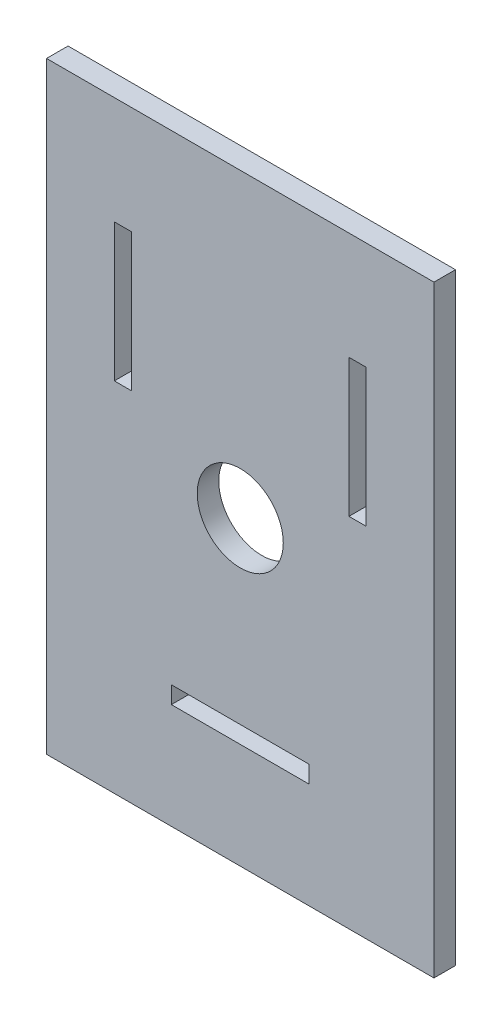
ISO-10303-21;
HEADER;
FILE_DESCRIPTION(('STEP AP214'),'2;1');
FILE_NAME('part.step','',(''),(''),'','','');
FILE_SCHEMA(('AUTOMOTIVE_DESIGN { 1 0 10303 214 1 1 1 1 }'));
ENDSEC;
DATA;
#1=APPLICATION_CONTEXT('core data for automotive mechanical design processes');
#2=APPLICATION_PROTOCOL_DEFINITION('international standard','automotive_design',2000,#1);
#3=PRODUCT_CONTEXT('',#1,'mechanical');
#4=PRODUCT('Part','Part','',(#3));
#5=PRODUCT_RELATED_PRODUCT_CATEGORY('part','',(#4));
#6=PRODUCT_DEFINITION_FORMATION('','',#4);
#7=PRODUCT_DEFINITION_CONTEXT('part definition',#1,'design');
#8=PRODUCT_DEFINITION('design','',#6,#7);
#9=PRODUCT_DEFINITION_SHAPE('','',#8);
#10=(LENGTH_UNIT() NAMED_UNIT(*) SI_UNIT(.MILLI.,.METRE.));
#11=(NAMED_UNIT(*) PLANE_ANGLE_UNIT() SI_UNIT($,.RADIAN.));
#12=(NAMED_UNIT(*) SI_UNIT($,.STERADIAN.) SOLID_ANGLE_UNIT());
#13=UNCERTAINTY_MEASURE_WITH_UNIT(LENGTH_MEASURE(1.E-05),#10,'distance_accuracy_value','');
#14=(GEOMETRIC_REPRESENTATION_CONTEXT(3) GLOBAL_UNCERTAINTY_ASSIGNED_CONTEXT((#13)) GLOBAL_UNIT_ASSIGNED_CONTEXT((#10,
#11,#12)) REPRESENTATION_CONTEXT('',''));
#15=CARTESIAN_POINT('',(0.,0.,0.));
#16=DIRECTION('',(0.,0.,1.));
#17=DIRECTION('',(1.,0.,0.));
#18=AXIS2_PLACEMENT_3D('',#15,#16,#17);
#19=CARTESIAN_POINT('',(0.,0.,-1.));
#20=DIRECTION('',(0.,0.,1.));
#21=DIRECTION('',(1.,0.,0.));
#22=AXIS2_PLACEMENT_3D('',#19,#20,#21);
#23=PLANE('',#22);
#24=DIRECTION('',(1.,0.,0.));
#25=VECTOR('',#24,1.);
#26=CARTESIAN_POINT('',(0.,-9.09999999999999,-1.));
#27=LINE('',#26,#25);
#28=CARTESIAN_POINT('',(-3.2,-9.09999999999999,-1.));
#29=VERTEX_POINT('',#28);
#30=CARTESIAN_POINT('',(3.2,-9.09999999999999,-1.));
#31=VERTEX_POINT('',#30);
#32=EDGE_CURVE('E177',#29,#31,#27,.T.);
#33=ORIENTED_EDGE('',*,*,#32,.T.);
#34=DIRECTION('',(0.,1.,0.));
#35=VECTOR('',#34,1.);
#36=CARTESIAN_POINT('',(3.2,0.,-1.));
#37=LINE('',#36,#35);
#38=CARTESIAN_POINT('',(3.2,-8.29999999999999,-1.));
#39=VERTEX_POINT('',#38);
#40=EDGE_CURVE('E180',#31,#39,#37,.T.);
#41=ORIENTED_EDGE('',*,*,#40,.T.);
#42=DIRECTION('',(-1.,0.,0.));
#43=VECTOR('',#42,1.);
#44=CARTESIAN_POINT('',(0.,-8.29999999999999,-1.));
#45=LINE('',#44,#43);
#46=CARTESIAN_POINT('',(-3.2,-8.29999999999999,-1.));
#47=VERTEX_POINT('',#46);
#48=EDGE_CURVE('E172',#39,#47,#45,.T.);
#49=ORIENTED_EDGE('',*,*,#48,.T.);
#50=DIRECTION('',(0.,-1.,0.));
#51=VECTOR('',#50,1.);
#52=CARTESIAN_POINT('',(-3.2,0.,-1.));
#53=LINE('',#52,#51);
#54=EDGE_CURVE('E152',#47,#29,#53,.T.);
#55=ORIENTED_EDGE('',*,*,#54,.T.);
#56=EDGE_LOOP('',(#33,#41,#49,#55));
#57=FACE_BOUND('',#56,.T.);
#58=CARTESIAN_POINT('',(0.,0.,-1.));
#59=DIRECTION('',(0.,0.,1.));
#60=DIRECTION('',(1.,0.,0.));
#61=AXIS2_PLACEMENT_3D('',#58,#59,#60);
#62=CIRCLE('',#61,2.);
#63=CARTESIAN_POINT('',(2.,0.,-1.));
#64=VERTEX_POINT('',#63);
#65=EDGE_CURVE('E184',#64,#64,#62,.T.);
#66=ORIENTED_EDGE('',*,*,#65,.T.);
#67=EDGE_LOOP('',(#66));
#68=FACE_BOUND('',#67,.T.);
#69=DIRECTION('',(0.,1.,0.));
#70=VECTOR('',#69,1.);
#71=CARTESIAN_POINT('',(8.99999999999999,14.,-1.));
#72=LINE('',#71,#70);
#73=CARTESIAN_POINT('',(9.,-14.,-1.));
#74=VERTEX_POINT('',#73);
#75=CARTESIAN_POINT('',(8.99999999999999,14.,-1.));
#76=VERTEX_POINT('',#75);
#77=EDGE_CURVE('E252',#74,#76,#72,.T.);
#78=ORIENTED_EDGE('',*,*,#77,.F.);
#79=DIRECTION('',(1.,0.,0.));
#80=VECTOR('',#79,1.);
#81=CARTESIAN_POINT('',(-9.,-14.,-1.));
#82=LINE('',#81,#80);
#83=CARTESIAN_POINT('',(-9.,-14.,-1.));
#84=VERTEX_POINT('',#83);
#85=EDGE_CURVE('E262',#84,#74,#82,.T.);
#86=ORIENTED_EDGE('',*,*,#85,.F.);
#87=DIRECTION('',(0.,-1.,0.));
#88=VECTOR('',#87,1.);
#89=CARTESIAN_POINT('',(-9.00000000000001,14.,-1.));
#90=LINE('',#89,#88);
#91=CARTESIAN_POINT('',(-9.00000000000001,14.,-1.));
#92=VERTEX_POINT('',#91);
#93=EDGE_CURVE('E259',#92,#84,#90,.T.);
#94=ORIENTED_EDGE('',*,*,#93,.F.);
#95=DIRECTION('',(-1.,0.,0.));
#96=VECTOR('',#95,1.);
#97=CARTESIAN_POINT('',(-9.00000000000001,14.,-1.));
#98=LINE('',#97,#96);
#99=EDGE_CURVE('E255',#76,#92,#98,.T.);
#100=ORIENTED_EDGE('',*,*,#99,.F.);
#101=EDGE_LOOP('',(#78,#86,#94,#100));
#102=FACE_BOUND('',#101,.T.);
#103=DIRECTION('',(1.,0.,0.));
#104=VECTOR('',#103,1.);
#105=CARTESIAN_POINT('',(0.,2.60000000000001,-1.));
#106=LINE('',#105,#104);
#107=CARTESIAN_POINT('',(5.05,2.60000000000001,-1.));
#108=VERTEX_POINT('',#107);
#109=CARTESIAN_POINT('',(5.85,2.60000000000001,-1.));
#110=VERTEX_POINT('',#109);
#111=EDGE_CURVE('E245',#108,#110,#106,.T.);
#112=ORIENTED_EDGE('',*,*,#111,.T.);
#113=DIRECTION('',(0.,1.,0.));
#114=VECTOR('',#113,1.);
#115=CARTESIAN_POINT('',(5.85,0.,-1.));
#116=LINE('',#115,#114);
#117=CARTESIAN_POINT('',(5.85,9.00000000000001,-1.));
#118=VERTEX_POINT('',#117);
#119=EDGE_CURVE('E248',#110,#118,#116,.T.);
#120=ORIENTED_EDGE('',*,*,#119,.T.);
#121=DIRECTION('',(-1.,0.,0.));
#122=VECTOR('',#121,1.);
#123=CARTESIAN_POINT('',(0.,9.00000000000001,-1.));
#124=LINE('',#123,#122);
#125=CARTESIAN_POINT('',(5.05,9.00000000000001,-1.));
#126=VERTEX_POINT('',#125);
#127=EDGE_CURVE('E233',#118,#126,#124,.T.);
#128=ORIENTED_EDGE('',*,*,#127,.T.);
#129=DIRECTION('',(0.,-1.,0.));
#130=VECTOR('',#129,1.);
#131=CARTESIAN_POINT('',(5.05,0.,-1.));
#132=LINE('',#131,#130);
#133=EDGE_CURVE('E242',#126,#108,#132,.T.);
#134=ORIENTED_EDGE('',*,*,#133,.T.);
#135=EDGE_LOOP('',(#112,#120,#128,#134));
#136=FACE_BOUND('',#135,.T.);
#137=DIRECTION('',(0.,1.,0.));
#138=VECTOR('',#137,1.);
#139=CARTESIAN_POINT('',(-5.85,0.,-1.));
#140=LINE('',#139,#138);
#141=CARTESIAN_POINT('',(-5.85,2.60000000000001,-1.));
#142=VERTEX_POINT('',#141);
#143=CARTESIAN_POINT('',(-5.85,9.00000000000001,-1.));
#144=VERTEX_POINT('',#143);
#145=EDGE_CURVE('E217',#142,#144,#140,.T.);
#146=ORIENTED_EDGE('',*,*,#145,.F.);
#147=DIRECTION('',(-1.,0.,0.));
#148=VECTOR('',#147,1.);
#149=CARTESIAN_POINT('',(0.,2.60000000000001,-1.));
#150=LINE('',#149,#148);
#151=CARTESIAN_POINT('',(-5.05,2.60000000000001,-1.));
#152=VERTEX_POINT('',#151);
#153=EDGE_CURVE('E204',#152,#142,#150,.T.);
#154=ORIENTED_EDGE('',*,*,#153,.F.);
#155=DIRECTION('',(0.,-1.,0.));
#156=VECTOR('',#155,1.);
#157=CARTESIAN_POINT('',(-5.05,0.,-1.));
#158=LINE('',#157,#156);
#159=CARTESIAN_POINT('',(-5.05,9.00000000000001,-1.));
#160=VERTEX_POINT('',#159);
#161=EDGE_CURVE('E212',#160,#152,#158,.T.);
#162=ORIENTED_EDGE('',*,*,#161,.F.);
#163=DIRECTION('',(1.,0.,0.));
#164=VECTOR('',#163,1.);
#165=CARTESIAN_POINT('',(0.,9.00000000000001,-1.));
#166=LINE('',#165,#164);
#167=EDGE_CURVE('E215',#144,#160,#166,.T.);
#168=ORIENTED_EDGE('',*,*,#167,.F.);
#169=EDGE_LOOP('',(#146,#154,#162,#168));
#170=FACE_BOUND('',#169,.T.);
#171=ADVANCED_FACE('F32',(#57,#68,#102,#136,#170),#23,.F.);
#172=CARTESIAN_POINT('',(0.,0.,0.));
#173=DIRECTION('',(0.,0.,1.));
#174=DIRECTION('',(1.,0.,0.));
#175=AXIS2_PLACEMENT_3D('',#172,#173,#174);
#176=PLANE('',#175);
#177=DIRECTION('',(0.,1.,0.));
#178=VECTOR('',#177,1.);
#179=CARTESIAN_POINT('',(3.2,-8.29999999999999,0.));
#180=LINE('',#179,#178);
#181=CARTESIAN_POINT('',(3.2,-9.09999999999999,0.));
#182=VERTEX_POINT('',#181);
#183=CARTESIAN_POINT('',(3.2,-8.29999999999999,0.));
#184=VERTEX_POINT('',#183);
#185=EDGE_CURVE('E57',#182,#184,#180,.T.);
#186=ORIENTED_EDGE('',*,*,#185,.F.);
#187=DIRECTION('',(1.,0.,0.));
#188=VECTOR('',#187,1.);
#189=CARTESIAN_POINT('',(-3.2,-9.09999999999999,0.));
#190=LINE('',#189,#188);
#191=CARTESIAN_POINT('',(-3.2,-9.09999999999999,0.));
#192=VERTEX_POINT('',#191);
#193=EDGE_CURVE('E165',#192,#182,#190,.T.);
#194=ORIENTED_EDGE('',*,*,#193,.F.);
#195=DIRECTION('',(0.,-1.,0.));
#196=VECTOR('',#195,1.);
#197=CARTESIAN_POINT('',(-3.2,-8.29999999999999,0.));
#198=LINE('',#197,#196);
#199=CARTESIAN_POINT('',(-3.2,-8.29999999999999,0.));
#200=VERTEX_POINT('',#199);
#201=EDGE_CURVE('E149',#200,#192,#198,.T.);
#202=ORIENTED_EDGE('',*,*,#201,.F.);
#203=DIRECTION('',(-1.,0.,0.));
#204=VECTOR('',#203,1.);
#205=CARTESIAN_POINT('',(-3.2,-8.29999999999999,0.));
#206=LINE('',#205,#204);
#207=EDGE_CURVE('E158',#184,#200,#206,.T.);
#208=ORIENTED_EDGE('',*,*,#207,.F.);
#209=EDGE_LOOP('',(#186,#194,#202,#208));
#210=FACE_BOUND('',#209,.T.);
#211=CARTESIAN_POINT('',(0.,0.,0.));
#212=DIRECTION('',(0.,0.,1.));
#213=DIRECTION('',(1.,0.,0.));
#214=AXIS2_PLACEMENT_3D('',#211,#212,#213);
#215=CIRCLE('',#214,2.);
#216=CARTESIAN_POINT('',(2.,0.,0.));
#217=VERTEX_POINT('',#216);
#218=EDGE_CURVE('E183',#217,#217,#215,.T.);
#219=ORIENTED_EDGE('',*,*,#218,.F.);
#220=EDGE_LOOP('',(#219));
#221=FACE_BOUND('',#220,.T.);
#222=DIRECTION('',(0.,1.,0.));
#223=VECTOR('',#222,1.);
#224=CARTESIAN_POINT('',(5.85,9.00000000000001,0.));
#225=LINE('',#224,#223);
#226=CARTESIAN_POINT('',(5.85,2.60000000000001,0.));
#227=VERTEX_POINT('',#226);
#228=CARTESIAN_POINT('',(5.85,9.00000000000001,0.));
#229=VERTEX_POINT('',#228);
#230=EDGE_CURVE('E219',#227,#229,#225,.T.);
#231=ORIENTED_EDGE('',*,*,#230,.F.);
#232=DIRECTION('',(1.,0.,0.));
#233=VECTOR('',#232,1.);
#234=CARTESIAN_POINT('',(5.05,2.60000000000001,0.));
#235=LINE('',#234,#233);
#236=CARTESIAN_POINT('',(5.05,2.60000000000001,0.));
#237=VERTEX_POINT('',#236);
#238=EDGE_CURVE('E227',#237,#227,#235,.T.);
#239=ORIENTED_EDGE('',*,*,#238,.F.);
#240=DIRECTION('',(0.,-1.,0.));
#241=VECTOR('',#240,1.);
#242=CARTESIAN_POINT('',(5.05,9.00000000000001,0.));
#243=LINE('',#242,#241);
#244=CARTESIAN_POINT('',(5.05,9.00000000000001,0.));
#245=VERTEX_POINT('',#244);
#246=EDGE_CURVE('E224',#245,#237,#243,.T.);
#247=ORIENTED_EDGE('',*,*,#246,.F.);
#248=DIRECTION('',(-1.,0.,0.));
#249=VECTOR('',#248,1.);
#250=CARTESIAN_POINT('',(5.05,9.00000000000001,0.));
#251=LINE('',#250,#249);
#252=EDGE_CURVE('E221',#229,#245,#251,.T.);
#253=ORIENTED_EDGE('',*,*,#252,.F.);
#254=EDGE_LOOP('',(#231,#239,#247,#253));
#255=FACE_BOUND('',#254,.T.);
#256=DIRECTION('',(0.,1.,0.));
#257=VECTOR('',#256,1.);
#258=CARTESIAN_POINT('',(8.99999999999999,14.,0.));
#259=LINE('',#258,#257);
#260=CARTESIAN_POINT('',(9.,-14.,0.));
#261=VERTEX_POINT('',#260);
#262=CARTESIAN_POINT('',(8.99999999999999,14.,0.));
#263=VERTEX_POINT('',#262);
#264=EDGE_CURVE('E251',#261,#263,#259,.T.);
#265=ORIENTED_EDGE('',*,*,#264,.T.);
#266=DIRECTION('',(-1.,0.,0.));
#267=VECTOR('',#266,1.);
#268=CARTESIAN_POINT('',(-9.00000000000001,14.,0.));
#269=LINE('',#268,#267);
#270=CARTESIAN_POINT('',(-9.00000000000001,14.,0.));
#271=VERTEX_POINT('',#270);
#272=EDGE_CURVE('E267',#263,#271,#269,.T.);
#273=ORIENTED_EDGE('',*,*,#272,.T.);
#274=DIRECTION('',(0.,-1.,0.));
#275=VECTOR('',#274,1.);
#276=CARTESIAN_POINT('',(-9.00000000000001,14.,0.));
#277=LINE('',#276,#275);
#278=CARTESIAN_POINT('',(-9.,-14.,0.));
#279=VERTEX_POINT('',#278);
#280=EDGE_CURVE('E270',#271,#279,#277,.T.);
#281=ORIENTED_EDGE('',*,*,#280,.T.);
#282=DIRECTION('',(1.,0.,0.));
#283=VECTOR('',#282,1.);
#284=CARTESIAN_POINT('',(-9.,-14.,0.));
#285=LINE('',#284,#283);
#286=EDGE_CURVE('E256',#279,#261,#285,.T.);
#287=ORIENTED_EDGE('',*,*,#286,.T.);
#288=EDGE_LOOP('',(#265,#273,#281,#287));
#289=FACE_BOUND('',#288,.T.);
#290=DIRECTION('',(-1.,0.,0.));
#291=VECTOR('',#290,1.);
#292=CARTESIAN_POINT('',(-5.05,2.60000000000001,0.));
#293=LINE('',#292,#291);
#294=CARTESIAN_POINT('',(-5.05,2.60000000000001,0.));
#295=VERTEX_POINT('',#294);
#296=CARTESIAN_POINT('',(-5.85,2.60000000000001,0.));
#297=VERTEX_POINT('',#296);
#298=EDGE_CURVE('E192',#295,#297,#293,.T.);
#299=ORIENTED_EDGE('',*,*,#298,.T.);
#300=DIRECTION('',(0.,1.,0.));
#301=VECTOR('',#300,1.);
#302=CARTESIAN_POINT('',(-5.85,9.00000000000001,0.));
#303=LINE('',#302,#301);
#304=CARTESIAN_POINT('',(-5.85,9.00000000000001,0.));
#305=VERTEX_POINT('',#304);
#306=EDGE_CURVE('E187',#297,#305,#303,.T.);
#307=ORIENTED_EDGE('',*,*,#306,.T.);
#308=DIRECTION('',(1.,0.,0.));
#309=VECTOR('',#308,1.);
#310=CARTESIAN_POINT('',(-5.05,9.00000000000001,0.));
#311=LINE('',#310,#309);
#312=CARTESIAN_POINT('',(-5.05,9.00000000000001,0.));
#313=VERTEX_POINT('',#312);
#314=EDGE_CURVE('E198',#305,#313,#311,.T.);
#315=ORIENTED_EDGE('',*,*,#314,.T.);
#316=DIRECTION('',(0.,-1.,0.));
#317=VECTOR('',#316,1.);
#318=CARTESIAN_POINT('',(-5.05,9.00000000000001,0.));
#319=LINE('',#318,#317);
#320=EDGE_CURVE('E195',#313,#295,#319,.T.);
#321=ORIENTED_EDGE('',*,*,#320,.T.);
#322=EDGE_LOOP('',(#299,#307,#315,#321));
#323=FACE_BOUND('',#322,.T.);
#324=ADVANCED_FACE('F162',(#210,#221,#255,#289,#323),#176,.T.);
#325=CARTESIAN_POINT('',(8.99999999999999,14.,-1.));
#326=DIRECTION('',(1.,0.,0.));
#327=DIRECTION('',(0.,1.,0.));
#328=AXIS2_PLACEMENT_3D('',#325,#326,#327);
#329=PLANE('',#328);
#330=ORIENTED_EDGE('',*,*,#264,.F.);
#331=DIRECTION('',(0.,0.,1.));
#332=VECTOR('',#331,1.);
#333=CARTESIAN_POINT('',(9.,-14.,-1.));
#334=LINE('',#333,#332);
#335=EDGE_CURVE('E11',#74,#261,#334,.T.);
#336=ORIENTED_EDGE('',*,*,#335,.F.);
#337=ORIENTED_EDGE('',*,*,#77,.T.);
#338=DIRECTION('',(0.,0.,1.));
#339=VECTOR('',#338,1.);
#340=CARTESIAN_POINT('',(8.99999999999999,14.,-1.));
#341=LINE('',#340,#339);
#342=EDGE_CURVE('E36',#76,#263,#341,.T.);
#343=ORIENTED_EDGE('',*,*,#342,.T.);
#344=EDGE_LOOP('',(#330,#336,#337,#343));
#345=FACE_BOUND('',#344,.T.);
#346=ADVANCED_FACE('F34',(#345),#329,.T.);
#347=CARTESIAN_POINT('',(-9.,-14.,-1.));
#348=DIRECTION('',(0.,-1.,0.));
#349=DIRECTION('',(0.,0.,-1.));
#350=AXIS2_PLACEMENT_3D('',#347,#348,#349);
#351=PLANE('',#350);
#352=ORIENTED_EDGE('',*,*,#286,.F.);
#353=DIRECTION('',(0.,0.,1.));
#354=VECTOR('',#353,1.);
#355=CARTESIAN_POINT('',(-9.,-14.,-1.));
#356=LINE('',#355,#354);
#357=EDGE_CURVE('E41',#84,#279,#356,.T.);
#358=ORIENTED_EDGE('',*,*,#357,.F.);
#359=ORIENTED_EDGE('',*,*,#85,.T.);
#360=ORIENTED_EDGE('',*,*,#335,.T.);
#361=EDGE_LOOP('',(#352,#358,#359,#360));
#362=FACE_BOUND('',#361,.T.);
#363=ADVANCED_FACE('F288',(#362),#351,.T.);
#364=CARTESIAN_POINT('',(-9.00000000000001,14.,-1.));
#365=DIRECTION('',(-1.,0.,0.));
#366=DIRECTION('',(0.,-1.,0.));
#367=AXIS2_PLACEMENT_3D('',#364,#365,#366);
#368=PLANE('',#367);
#369=ORIENTED_EDGE('',*,*,#280,.F.);
#370=DIRECTION('',(0.,0.,1.));
#371=VECTOR('',#370,1.);
#372=CARTESIAN_POINT('',(-9.00000000000001,14.,-1.));
#373=LINE('',#372,#371);
#374=EDGE_CURVE('E275',#92,#271,#373,.T.);
#375=ORIENTED_EDGE('',*,*,#374,.F.);
#376=ORIENTED_EDGE('',*,*,#93,.T.);
#377=ORIENTED_EDGE('',*,*,#357,.T.);
#378=EDGE_LOOP('',(#369,#375,#376,#377));
#379=FACE_BOUND('',#378,.T.);
#380=ADVANCED_FACE('F294',(#379),#368,.T.);
#381=CARTESIAN_POINT('',(-9.00000000000001,14.,-1.));
#382=DIRECTION('',(0.,1.,0.));
#383=DIRECTION('',(0.,0.,1.));
#384=AXIS2_PLACEMENT_3D('',#381,#382,#383);
#385=PLANE('',#384);
#386=ORIENTED_EDGE('',*,*,#272,.F.);
#387=ORIENTED_EDGE('',*,*,#342,.F.);
#388=ORIENTED_EDGE('',*,*,#99,.T.);
#389=ORIENTED_EDGE('',*,*,#374,.T.);
#390=EDGE_LOOP('',(#386,#387,#388,#389));
#391=FACE_BOUND('',#390,.T.);
#392=ADVANCED_FACE('F283',(#391),#385,.T.);
#393=CARTESIAN_POINT('',(5.85,9.00000000000001,-1.6));
#394=DIRECTION('',(1.,0.,0.));
#395=DIRECTION('',(0.,1.,0.));
#396=AXIS2_PLACEMENT_3D('',#393,#394,#395);
#397=PLANE('',#396);
#398=DIRECTION('',(0.,0.,1.));
#399=VECTOR('',#398,1.);
#400=CARTESIAN_POINT('',(5.85,2.60000000000001,-1.6));
#401=LINE('',#400,#399);
#402=EDGE_CURVE('E231',#110,#227,#401,.T.);
#403=ORIENTED_EDGE('',*,*,#402,.T.);
#404=ORIENTED_EDGE('',*,*,#230,.T.);
#405=DIRECTION('',(0.,0.,1.));
#406=VECTOR('',#405,1.);
#407=CARTESIAN_POINT('',(5.85,9.00000000000001,-1.6));
#408=LINE('',#407,#406);
#409=EDGE_CURVE('E230',#118,#229,#408,.T.);
#410=ORIENTED_EDGE('',*,*,#409,.F.);
#411=ORIENTED_EDGE('',*,*,#119,.F.);
#412=EDGE_LOOP('',(#403,#404,#410,#411));
#413=FACE_BOUND('',#412,.T.);
#414=ADVANCED_FACE('F301',(#413),#397,.F.);
#415=CARTESIAN_POINT('',(5.05,2.60000000000001,-1.6));
#416=DIRECTION('',(0.,-1.,0.));
#417=DIRECTION('',(0.,0.,-1.));
#418=AXIS2_PLACEMENT_3D('',#415,#416,#417);
#419=PLANE('',#418);
#420=DIRECTION('',(0.,0.,1.));
#421=VECTOR('',#420,1.);
#422=CARTESIAN_POINT('',(5.05,2.60000000000001,-1.6));
#423=LINE('',#422,#421);
#424=EDGE_CURVE('E234',#108,#237,#423,.T.);
#425=ORIENTED_EDGE('',*,*,#424,.T.);
#426=ORIENTED_EDGE('',*,*,#238,.T.);
#427=ORIENTED_EDGE('',*,*,#402,.F.);
#428=ORIENTED_EDGE('',*,*,#111,.F.);
#429=EDGE_LOOP('',(#425,#426,#427,#428));
#430=FACE_BOUND('',#429,.T.);
#431=ADVANCED_FACE('F314',(#430),#419,.F.);
#432=CARTESIAN_POINT('',(5.05,9.00000000000001,-1.6));
#433=DIRECTION('',(-1.,0.,0.));
#434=DIRECTION('',(0.,-1.,0.));
#435=AXIS2_PLACEMENT_3D('',#432,#433,#434);
#436=PLANE('',#435);
#437=DIRECTION('',(0.,0.,1.));
#438=VECTOR('',#437,1.);
#439=CARTESIAN_POINT('',(5.05,9.00000000000001,-1.6));
#440=LINE('',#439,#438);
#441=EDGE_CURVE('E236',#126,#245,#440,.T.);
#442=ORIENTED_EDGE('',*,*,#441,.T.);
#443=ORIENTED_EDGE('',*,*,#246,.T.);
#444=ORIENTED_EDGE('',*,*,#424,.F.);
#445=ORIENTED_EDGE('',*,*,#133,.F.);
#446=EDGE_LOOP('',(#442,#443,#444,#445));
#447=FACE_BOUND('',#446,.T.);
#448=ADVANCED_FACE('F320',(#447),#436,.F.);
#449=CARTESIAN_POINT('',(5.05,9.00000000000001,-1.6));
#450=DIRECTION('',(0.,1.,0.));
#451=DIRECTION('',(0.,0.,1.));
#452=AXIS2_PLACEMENT_3D('',#449,#450,#451);
#453=PLANE('',#452);
#454=ORIENTED_EDGE('',*,*,#409,.T.);
#455=ORIENTED_EDGE('',*,*,#252,.T.);
#456=ORIENTED_EDGE('',*,*,#441,.F.);
#457=ORIENTED_EDGE('',*,*,#127,.F.);
#458=EDGE_LOOP('',(#454,#455,#456,#457));
#459=FACE_BOUND('',#458,.T.);
#460=ADVANCED_FACE('F316',(#459),#453,.F.);
#461=CARTESIAN_POINT('',(-5.85,9.00000000000001,-1.6));
#462=DIRECTION('',(1.,0.,0.));
#463=DIRECTION('',(0.,1.,0.));
#464=AXIS2_PLACEMENT_3D('',#461,#462,#463);
#465=PLANE('',#464);
#466=ORIENTED_EDGE('',*,*,#145,.T.);
#467=DIRECTION('',(0.,0.,1.));
#468=VECTOR('',#467,1.);
#469=CARTESIAN_POINT('',(-5.85,9.00000000000001,-1.6));
#470=LINE('',#469,#468);
#471=EDGE_CURVE('E202',#144,#305,#470,.T.);
#472=ORIENTED_EDGE('',*,*,#471,.T.);
#473=ORIENTED_EDGE('',*,*,#306,.F.);
#474=DIRECTION('',(0.,0.,1.));
#475=VECTOR('',#474,1.);
#476=CARTESIAN_POINT('',(-5.85,2.60000000000001,-1.6));
#477=LINE('',#476,#475);
#478=EDGE_CURVE('E201',#142,#297,#477,.T.);
#479=ORIENTED_EDGE('',*,*,#478,.F.);
#480=EDGE_LOOP('',(#466,#472,#473,#479));
#481=FACE_BOUND('',#480,.T.);
#482=ADVANCED_FACE('F319',(#481),#465,.T.);
#483=CARTESIAN_POINT('',(-5.05,9.00000000000001,-1.6));
#484=DIRECTION('',(0.,-1.,0.));
#485=DIRECTION('',(0.,0.,-1.));
#486=AXIS2_PLACEMENT_3D('',#483,#484,#485);
#487=PLANE('',#486);
#488=ORIENTED_EDGE('',*,*,#167,.T.);
#489=DIRECTION('',(0.,0.,1.));
#490=VECTOR('',#489,1.);
#491=CARTESIAN_POINT('',(-5.05,9.00000000000001,-1.6));
#492=LINE('',#491,#490);
#493=EDGE_CURVE('E205',#160,#313,#492,.T.);
#494=ORIENTED_EDGE('',*,*,#493,.T.);
#495=ORIENTED_EDGE('',*,*,#314,.F.);
#496=ORIENTED_EDGE('',*,*,#471,.F.);
#497=EDGE_LOOP('',(#488,#494,#495,#496));
#498=FACE_BOUND('',#497,.T.);
#499=ADVANCED_FACE('F330',(#498),#487,.T.);
#500=CARTESIAN_POINT('',(-5.05,9.00000000000001,-1.6));
#501=DIRECTION('',(-1.,0.,0.));
#502=DIRECTION('',(0.,-1.,0.));
#503=AXIS2_PLACEMENT_3D('',#500,#501,#502);
#504=PLANE('',#503);
#505=ORIENTED_EDGE('',*,*,#161,.T.);
#506=DIRECTION('',(0.,0.,1.));
#507=VECTOR('',#506,1.);
#508=CARTESIAN_POINT('',(-5.05,2.60000000000001,-1.6));
#509=LINE('',#508,#507);
#510=EDGE_CURVE('E207',#152,#295,#509,.T.);
#511=ORIENTED_EDGE('',*,*,#510,.T.);
#512=ORIENTED_EDGE('',*,*,#320,.F.);
#513=ORIENTED_EDGE('',*,*,#493,.F.);
#514=EDGE_LOOP('',(#505,#511,#512,#513));
#515=FACE_BOUND('',#514,.T.);
#516=ADVANCED_FACE('F336',(#515),#504,.T.);
#517=CARTESIAN_POINT('',(-5.05,2.60000000000001,-1.6));
#518=DIRECTION('',(0.,1.,0.));
#519=DIRECTION('',(0.,0.,1.));
#520=AXIS2_PLACEMENT_3D('',#517,#518,#519);
#521=PLANE('',#520);
#522=ORIENTED_EDGE('',*,*,#153,.T.);
#523=ORIENTED_EDGE('',*,*,#478,.T.);
#524=ORIENTED_EDGE('',*,*,#298,.F.);
#525=ORIENTED_EDGE('',*,*,#510,.F.);
#526=EDGE_LOOP('',(#522,#523,#524,#525));
#527=FACE_BOUND('',#526,.T.);
#528=ADVANCED_FACE('F332',(#527),#521,.T.);
#529=CARTESIAN_POINT('',(0.,0.,-1.));
#530=DIRECTION('',(0.,0.,1.));
#531=DIRECTION('',(1.,0.,0.));
#532=AXIS2_PLACEMENT_3D('',#529,#530,#531);
#533=CYLINDRICAL_SURFACE('',#532,2.);
#534=ORIENTED_EDGE('',*,*,#65,.F.);
#535=EDGE_LOOP('',(#534));
#536=FACE_BOUND('',#535,.T.);
#537=ORIENTED_EDGE('',*,*,#218,.T.);
#538=EDGE_LOOP('',(#537));
#539=FACE_BOUND('',#538,.T.);
#540=ADVANCED_FACE('F335',(#536,#539),#533,.F.);
#541=CARTESIAN_POINT('',(3.2,-8.29999999999999,-1.6));
#542=DIRECTION('',(1.,0.,0.));
#543=DIRECTION('',(0.,0.,-1.));
#544=AXIS2_PLACEMENT_3D('',#541,#542,#543);
#545=PLANE('',#544);
#546=DIRECTION('',(0.,0.,1.));
#547=VECTOR('',#546,1.);
#548=CARTESIAN_POINT('',(3.2,-9.09999999999999,-1.6));
#549=LINE('',#548,#547);
#550=EDGE_CURVE('E170',#31,#182,#549,.T.);
#551=ORIENTED_EDGE('',*,*,#550,.T.);
#552=ORIENTED_EDGE('',*,*,#185,.T.);
#553=DIRECTION('',(0.,0.,1.));
#554=VECTOR('',#553,1.);
#555=CARTESIAN_POINT('',(3.2,-8.29999999999999,-1.6));
#556=LINE('',#555,#554);
#557=EDGE_CURVE('E155',#39,#184,#556,.T.);
#558=ORIENTED_EDGE('',*,*,#557,.F.);
#559=ORIENTED_EDGE('',*,*,#40,.F.);
#560=EDGE_LOOP('',(#551,#552,#558,#559));
#561=FACE_BOUND('',#560,.T.);
#562=ADVANCED_FACE('F346',(#561),#545,.F.);
#563=CARTESIAN_POINT('',(-3.2,-9.09999999999999,-1.6));
#564=DIRECTION('',(0.,-1.,0.));
#565=DIRECTION('',(0.,0.,-1.));
#566=AXIS2_PLACEMENT_3D('',#563,#564,#565);
#567=PLANE('',#566);
#568=DIRECTION('',(0.,0.,1.));
#569=VECTOR('',#568,1.);
#570=CARTESIAN_POINT('',(-3.2,-9.09999999999999,-1.6));
#571=LINE('',#570,#569);
#572=EDGE_CURVE('E154',#29,#192,#571,.T.);
#573=ORIENTED_EDGE('',*,*,#572,.T.);
#574=ORIENTED_EDGE('',*,*,#193,.T.);
#575=ORIENTED_EDGE('',*,*,#550,.F.);
#576=ORIENTED_EDGE('',*,*,#32,.F.);
#577=EDGE_LOOP('',(#573,#574,#575,#576));
#578=FACE_BOUND('',#577,.T.);
#579=ADVANCED_FACE('F350',(#578),#567,.F.);
#580=CARTESIAN_POINT('',(-3.2,-8.29999999999999,-1.6));
#581=DIRECTION('',(-1.,0.,0.));
#582=DIRECTION('',(0.,-1.,0.));
#583=AXIS2_PLACEMENT_3D('',#580,#581,#582);
#584=PLANE('',#583);
#585=DIRECTION('',(0.,0.,1.));
#586=VECTOR('',#585,1.);
#587=CARTESIAN_POINT('',(-3.2,-8.29999999999999,-1.6));
#588=LINE('',#587,#586);
#589=EDGE_CURVE('E49',#47,#200,#588,.T.);
#590=ORIENTED_EDGE('',*,*,#589,.T.);
#591=ORIENTED_EDGE('',*,*,#201,.T.);
#592=ORIENTED_EDGE('',*,*,#572,.F.);
#593=ORIENTED_EDGE('',*,*,#54,.F.);
#594=EDGE_LOOP('',(#590,#591,#592,#593));
#595=FACE_BOUND('',#594,.T.);
#596=ADVANCED_FACE('F146',(#595),#584,.F.);
#597=CARTESIAN_POINT('',(-3.2,-8.29999999999999,-1.6));
#598=DIRECTION('',(0.,1.,0.));
#599=DIRECTION('',(0.,0.,1.));
#600=AXIS2_PLACEMENT_3D('',#597,#598,#599);
#601=PLANE('',#600);
#602=ORIENTED_EDGE('',*,*,#557,.T.);
#603=ORIENTED_EDGE('',*,*,#207,.T.);
#604=ORIENTED_EDGE('',*,*,#589,.F.);
#605=ORIENTED_EDGE('',*,*,#48,.F.);
#606=EDGE_LOOP('',(#602,#603,#604,#605));
#607=FACE_BOUND('',#606,.T.);
#608=ADVANCED_FACE('F159',(#607),#601,.F.);
#609=CLOSED_SHELL('',(#171,#324,#346,#363,#380,#392,#414,#431,#448,#460,#482,#499,#516,#528,
#540,#562,#579,#596,#608));
#610=MANIFOLD_SOLID_BREP('B2',#609);
#611=ADVANCED_BREP_SHAPE_REPRESENTATION('',(#18,#610),#14);
#612=SHAPE_DEFINITION_REPRESENTATION(#9,#611);
ENDSEC;
END-ISO-10303-21;
